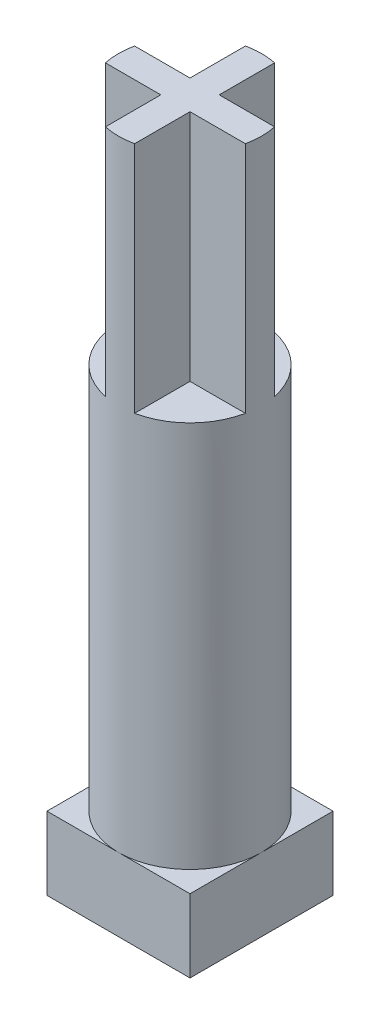
ISO-10303-21;
HEADER;
FILE_DESCRIPTION(('STEP AP214'),'2;1');
FILE_NAME('part.step','',(''),(''),'','','');
FILE_SCHEMA(('AUTOMOTIVE_DESIGN { 1 0 10303 214 1 1 1 1 }'));
ENDSEC;
DATA;
#1=APPLICATION_CONTEXT('core data for automotive mechanical design processes');
#2=APPLICATION_PROTOCOL_DEFINITION('international standard','automotive_design',2000,#1);
#3=PRODUCT_CONTEXT('',#1,'mechanical');
#4=PRODUCT('Part','Part','',(#3));
#5=PRODUCT_RELATED_PRODUCT_CATEGORY('part','',(#4));
#6=PRODUCT_DEFINITION_FORMATION('','',#4);
#7=PRODUCT_DEFINITION_CONTEXT('part definition',#1,'design');
#8=PRODUCT_DEFINITION('design','',#6,#7);
#9=PRODUCT_DEFINITION_SHAPE('','',#8);
#10=(LENGTH_UNIT() NAMED_UNIT(*) SI_UNIT(.MILLI.,.METRE.));
#11=(NAMED_UNIT(*) PLANE_ANGLE_UNIT() SI_UNIT($,.RADIAN.));
#12=(NAMED_UNIT(*) SI_UNIT($,.STERADIAN.) SOLID_ANGLE_UNIT());
#13=UNCERTAINTY_MEASURE_WITH_UNIT(LENGTH_MEASURE(1.E-05),#10,'distance_accuracy_value','');
#14=(GEOMETRIC_REPRESENTATION_CONTEXT(3) GLOBAL_UNCERTAINTY_ASSIGNED_CONTEXT((#13)) GLOBAL_UNIT_ASSIGNED_CONTEXT((#10,
#11,#12)) REPRESENTATION_CONTEXT('',''));
#15=CARTESIAN_POINT('',(0.,0.,0.));
#16=DIRECTION('',(0.,0.,1.));
#17=DIRECTION('',(1.,0.,0.));
#18=AXIS2_PLACEMENT_3D('',#15,#16,#17);
#19=CARTESIAN_POINT('',(-35.4317426595789,-18.3276372888627,44.8719558536028));
#20=DIRECTION('',(0.,-1.,0.));
#21=DIRECTION('',(0.,0.,-1.));
#22=AXIS2_PLACEMENT_3D('',#19,#20,#21);
#23=CYLINDRICAL_SURFACE('',#22,2.45);
#24=CARTESIAN_POINT('',(-35.4317426595789,-17.3276372888627,44.8719558536028));
#25=DIRECTION('',(0.,1.,0.));
#26=DIRECTION('',(0.,0.,1.));
#27=AXIS2_PLACEMENT_3D('',#24,#25,#26);
#28=CIRCLE('',#27,2.45);
#29=CARTESIAN_POINT('',(-34.9317426595789,-17.3276372888627,47.2703928446451));
#30=VERTEX_POINT('',#29);
#31=CARTESIAN_POINT('',(-33.0333056685366,-17.3276372888627,45.3719558536028));
#32=VERTEX_POINT('',#31);
#33=EDGE_CURVE('E12',#30,#32,#28,.T.);
#34=ORIENTED_EDGE('',*,*,#33,.F.);
#35=DIRECTION('',(0.,-1.,0.));
#36=VECTOR('',#35,1.);
#37=CARTESIAN_POINT('',(-34.9317426595789,-9.32763728886266,47.2703928446451));
#38=LINE('',#37,#36);
#39=CARTESIAN_POINT('',(-34.9317426595789,-9.32763728886266,47.2703928446451));
#40=VERTEX_POINT('',#39);
#41=EDGE_CURVE('E282',#40,#30,#38,.T.);
#42=ORIENTED_EDGE('',*,*,#41,.F.);
#43=CARTESIAN_POINT('',(-35.4317426595789,-9.32763728886266,44.8719558536028));
#44=DIRECTION('',(0.,1.,0.));
#45=DIRECTION('',(0.,0.,1.));
#46=AXIS2_PLACEMENT_3D('',#43,#44,#45);
#47=CIRCLE('',#46,2.45);
#48=CARTESIAN_POINT('',(-35.9317426595789,-9.32763728886266,47.2703928446451));
#49=VERTEX_POINT('',#48);
#50=EDGE_CURVE('E233',#49,#40,#47,.T.);
#51=ORIENTED_EDGE('',*,*,#50,.F.);
#52=DIRECTION('',(0.,-1.,0.));
#53=VECTOR('',#52,1.);
#54=CARTESIAN_POINT('',(-35.9317426595789,-9.32763728886266,47.2703928446451));
#55=LINE('',#54,#53);
#56=CARTESIAN_POINT('',(-35.9317426595789,-17.3276372888627,47.2703928446451));
#57=VERTEX_POINT('',#56);
#58=EDGE_CURVE('E286',#49,#57,#55,.T.);
#59=ORIENTED_EDGE('',*,*,#58,.T.);
#60=CARTESIAN_POINT('',(-37.8301796506212,-17.3276372888627,45.3719558536028));
#61=VERTEX_POINT('',#60);
#62=EDGE_CURVE('E64',#61,#57,#28,.T.);
#63=ORIENTED_EDGE('',*,*,#62,.F.);
#64=DIRECTION('',(0.,-1.,0.));
#65=VECTOR('',#64,1.);
#66=CARTESIAN_POINT('',(-37.8301796506212,-9.32763728886266,45.3719558536028));
#67=LINE('',#66,#65);
#68=CARTESIAN_POINT('',(-37.8301796506212,-9.32763728886266,45.3719558536028));
#69=VERTEX_POINT('',#68);
#70=EDGE_CURVE('E294',#69,#61,#67,.T.);
#71=ORIENTED_EDGE('',*,*,#70,.F.);
#72=CARTESIAN_POINT('',(-37.8301796506212,-9.32763728886266,44.3719558536028));
#73=VERTEX_POINT('',#72);
#74=EDGE_CURVE('E248',#73,#69,#47,.T.);
#75=ORIENTED_EDGE('',*,*,#74,.F.);
#76=DIRECTION('',(0.,-1.,0.));
#77=VECTOR('',#76,1.);
#78=CARTESIAN_POINT('',(-37.8301796506212,-9.32763728886266,44.3719558536028));
#79=LINE('',#78,#77);
#80=CARTESIAN_POINT('',(-37.8301796506212,-17.3276372888627,44.3719558536028));
#81=VERTEX_POINT('',#80);
#82=EDGE_CURVE('E298',#73,#81,#79,.T.);
#83=ORIENTED_EDGE('',*,*,#82,.T.);
#84=CARTESIAN_POINT('',(-35.9317426595789,-17.3276372888627,42.4735188625605));
#85=VERTEX_POINT('',#84);
#86=EDGE_CURVE('E332',#85,#81,#28,.T.);
#87=ORIENTED_EDGE('',*,*,#86,.F.);
#88=DIRECTION('',(0.,-1.,0.));
#89=VECTOR('',#88,1.);
#90=CARTESIAN_POINT('',(-35.9317426595789,-9.32763728886266,42.4735188625605));
#91=LINE('',#90,#89);
#92=CARTESIAN_POINT('',(-35.9317426595789,-9.32763728886266,42.4735188625605));
#93=VERTEX_POINT('',#92);
#94=EDGE_CURVE('E306',#93,#85,#91,.T.);
#95=ORIENTED_EDGE('',*,*,#94,.F.);
#96=CARTESIAN_POINT('',(-34.9317426595789,-9.32763728886266,42.4735188625605));
#97=VERTEX_POINT('',#96);
#98=EDGE_CURVE('E234',#97,#93,#47,.T.);
#99=ORIENTED_EDGE('',*,*,#98,.F.);
#100=DIRECTION('',(0.,-1.,0.));
#101=VECTOR('',#100,1.);
#102=CARTESIAN_POINT('',(-34.9317426595789,-9.32763728886266,42.4735188625605));
#103=LINE('',#102,#101);
#104=CARTESIAN_POINT('',(-34.9317426595789,-17.3276372888627,42.4735188625605));
#105=VERTEX_POINT('',#104);
#106=EDGE_CURVE('E310',#97,#105,#103,.T.);
#107=ORIENTED_EDGE('',*,*,#106,.T.);
#108=CARTESIAN_POINT('',(-33.0333056685366,-17.3276372888627,44.3719558536028));
#109=VERTEX_POINT('',#108);
#110=EDGE_CURVE('E63',#109,#105,#28,.T.);
#111=ORIENTED_EDGE('',*,*,#110,.F.);
#112=DIRECTION('',(0.,-1.,0.));
#113=VECTOR('',#112,1.);
#114=CARTESIAN_POINT('',(-33.0333056685366,-9.32763728886266,44.3719558536028));
#115=LINE('',#114,#113);
#116=CARTESIAN_POINT('',(-33.0333056685366,-9.32763728886266,44.3719558536028));
#117=VERTEX_POINT('',#116);
#118=EDGE_CURVE('E318',#117,#109,#115,.T.);
#119=ORIENTED_EDGE('',*,*,#118,.F.);
#120=CARTESIAN_POINT('',(-33.0333056685366,-9.32763728886266,45.3719558536028));
#121=VERTEX_POINT('',#120);
#122=EDGE_CURVE('E229',#121,#117,#47,.T.);
#123=ORIENTED_EDGE('',*,*,#122,.F.);
#124=DIRECTION('',(0.,-1.,0.));
#125=VECTOR('',#124,1.);
#126=CARTESIAN_POINT('',(-33.0333056685366,-9.32763728886266,45.3719558536028));
#127=LINE('',#126,#125);
#128=EDGE_CURVE('E322',#121,#32,#127,.T.);
#129=ORIENTED_EDGE('',*,*,#128,.T.);
#130=EDGE_LOOP('',(#34,#42,#51,#59,#63,#71,#75,#83,#87,#95,#99,#107,#111,#119,#123,#129));
#131=FACE_BOUND('',#130,.T.);
#132=CARTESIAN_POINT('',(-35.4317426595789,-30.5776372888627,44.8719558536028));
#133=DIRECTION('',(0.,-1.,0.));
#134=DIRECTION('',(0.,0.,-1.));
#135=AXIS2_PLACEMENT_3D('',#132,#133,#134);
#136=CIRCLE('',#135,2.45);
#137=CARTESIAN_POINT('',(-35.4317426595789,-30.5776372888627,42.4219558536028));
#138=VERTEX_POINT('',#137);
#139=CARTESIAN_POINT('',(-32.9817426595789,-30.5776372888627,44.8719558536028));
#140=VERTEX_POINT('',#139);
#141=EDGE_CURVE('E212',#138,#140,#136,.T.);
#142=ORIENTED_EDGE('',*,*,#141,.F.);
#143=CARTESIAN_POINT('',(-37.8817426595789,-30.5776372888627,44.8719558536028));
#144=VERTEX_POINT('',#143);
#145=EDGE_CURVE('E71',#144,#138,#136,.T.);
#146=ORIENTED_EDGE('',*,*,#145,.F.);
#147=CARTESIAN_POINT('',(-35.4317426595789,-30.5776372888627,47.3219558536028));
#148=VERTEX_POINT('',#147);
#149=EDGE_CURVE('E75',#148,#144,#136,.T.);
#150=ORIENTED_EDGE('',*,*,#149,.F.);
#151=EDGE_CURVE('E220',#140,#148,#136,.T.);
#152=ORIENTED_EDGE('',*,*,#151,.F.);
#153=EDGE_LOOP('',(#142,#146,#150,#152));
#154=FACE_BOUND('',#153,.T.);
#155=ADVANCED_FACE('F55',(#131,#154),#23,.T.);
#156=CARTESIAN_POINT('',(-35.4317426595789,-17.3276372888627,44.8719558536028));
#157=DIRECTION('',(0.,1.,0.));
#158=DIRECTION('',(0.,0.,1.));
#159=AXIS2_PLACEMENT_3D('',#156,#157,#158);
#160=PLANE('',#159);
#161=DIRECTION('',(0.,0.,1.));
#162=VECTOR('',#161,1.);
#163=CARTESIAN_POINT('',(-35.9317426595788,-17.3276372888627,17.9513586437801));
#164=LINE('',#163,#162);
#165=CARTESIAN_POINT('',(-35.9317426595789,-17.3276372888627,45.3719558536028));
#166=VERTEX_POINT('',#165);
#167=EDGE_CURVE('E226',#166,#57,#164,.T.);
#168=ORIENTED_EDGE('',*,*,#167,.F.);
#169=DIRECTION('',(-1.,0.,0.));
#170=VECTOR('',#169,1.);
#171=CARTESIAN_POINT('',(-22.9042632367363,-17.3276372888627,45.3719558536028));
#172=LINE('',#171,#170);
#173=EDGE_CURVE('E276',#166,#61,#172,.T.);
#174=ORIENTED_EDGE('',*,*,#173,.T.);
#175=ORIENTED_EDGE('',*,*,#62,.T.);
#176=EDGE_LOOP('',(#168,#174,#175));
#177=FACE_BOUND('',#176,.T.);
#178=ADVANCED_FACE('F384',(#177),#160,.T.);
#179=DIRECTION('',(-1.,0.,0.));
#180=VECTOR('',#179,1.);
#181=CARTESIAN_POINT('',(-22.9042632367363,-17.3276372888627,44.3719558536028));
#182=LINE('',#181,#180);
#183=CARTESIAN_POINT('',(-35.9317426595789,-17.3276372888627,44.3719558536028));
#184=VERTEX_POINT('',#183);
#185=EDGE_CURVE('E272',#184,#81,#182,.T.);
#186=ORIENTED_EDGE('',*,*,#185,.F.);
#187=DIRECTION('',(0.,0.,-1.));
#188=VECTOR('',#187,1.);
#189=CARTESIAN_POINT('',(-35.931742659579,-17.3276372888627,17.9513586437802));
#190=LINE('',#189,#188);
#191=EDGE_CURVE('E269',#184,#85,#190,.T.);
#192=ORIENTED_EDGE('',*,*,#191,.T.);
#193=ORIENTED_EDGE('',*,*,#86,.T.);
#194=EDGE_LOOP('',(#186,#192,#193));
#195=FACE_BOUND('',#194,.T.);
#196=ADVANCED_FACE('F388',(#195),#160,.T.);
#197=DIRECTION('',(1.,0.,0.));
#198=VECTOR('',#197,1.);
#199=CARTESIAN_POINT('',(-22.9042632367363,-17.3276372888627,45.3719558536028));
#200=LINE('',#199,#198);
#201=CARTESIAN_POINT('',(-34.9317426595789,-17.3276372888627,45.3719558536028));
#202=VERTEX_POINT('',#201);
#203=EDGE_CURVE('E258',#202,#32,#200,.T.);
#204=ORIENTED_EDGE('',*,*,#203,.F.);
#205=DIRECTION('',(0.,0.,1.));
#206=VECTOR('',#205,1.);
#207=CARTESIAN_POINT('',(-34.9317426595789,-17.3276372888627,17.9513586437801));
#208=LINE('',#207,#206);
#209=EDGE_CURVE('E219',#202,#30,#208,.T.);
#210=ORIENTED_EDGE('',*,*,#209,.T.);
#211=ORIENTED_EDGE('',*,*,#33,.T.);
#212=EDGE_LOOP('',(#204,#210,#211));
#213=FACE_BOUND('',#212,.T.);
#214=ADVANCED_FACE('F392',(#213),#160,.T.);
#215=DIRECTION('',(0.,0.,-1.));
#216=VECTOR('',#215,1.);
#217=CARTESIAN_POINT('',(-34.931742659579,-17.3276372888627,17.9513586437802));
#218=LINE('',#217,#216);
#219=CARTESIAN_POINT('',(-34.9317426595789,-17.3276372888627,44.3719558536028));
#220=VERTEX_POINT('',#219);
#221=EDGE_CURVE('E265',#220,#105,#218,.T.);
#222=ORIENTED_EDGE('',*,*,#221,.F.);
#223=DIRECTION('',(1.,0.,0.));
#224=VECTOR('',#223,1.);
#225=CARTESIAN_POINT('',(-22.9042632367363,-17.3276372888627,44.3719558536028));
#226=LINE('',#225,#224);
#227=EDGE_CURVE('E262',#220,#109,#226,.T.);
#228=ORIENTED_EDGE('',*,*,#227,.T.);
#229=ORIENTED_EDGE('',*,*,#110,.T.);
#230=EDGE_LOOP('',(#222,#228,#229));
#231=FACE_BOUND('',#230,.T.);
#232=ADVANCED_FACE('F341',(#231),#160,.T.);
#233=CARTESIAN_POINT('',(-34.9317426595789,-9.32763728886266,17.9513586437801));
#234=DIRECTION('',(1.,0.,0.));
#235=DIRECTION('',(0.,0.,-1.));
#236=AXIS2_PLACEMENT_3D('',#233,#234,#235);
#237=PLANE('',#236);
#238=ORIENTED_EDGE('',*,*,#209,.F.);
#239=DIRECTION('',(0.,-1.,0.));
#240=VECTOR('',#239,1.);
#241=CARTESIAN_POINT('',(-34.9317426595789,-9.32763728886266,45.3719558536028));
#242=LINE('',#241,#240);
#243=CARTESIAN_POINT('',(-34.9317426595789,-9.32763728886266,45.3719558536028));
#244=VERTEX_POINT('',#243);
#245=EDGE_CURVE('E325',#244,#202,#242,.T.);
#246=ORIENTED_EDGE('',*,*,#245,.F.);
#247=DIRECTION('',(0.,0.,1.));
#248=VECTOR('',#247,1.);
#249=CARTESIAN_POINT('',(-34.9317426595789,-9.32763728886266,17.9513586437801));
#250=LINE('',#249,#248);
#251=EDGE_CURVE('E221',#244,#40,#250,.T.);
#252=ORIENTED_EDGE('',*,*,#251,.T.);
#253=ORIENTED_EDGE('',*,*,#41,.T.);
#254=EDGE_LOOP('',(#238,#246,#252,#253));
#255=FACE_BOUND('',#254,.T.);
#256=ADVANCED_FACE('F367',(#255),#237,.T.);
#257=CARTESIAN_POINT('',(-22.9042632367363,-9.32763728886266,45.3719558536028));
#258=DIRECTION('',(0.,0.,-1.));
#259=DIRECTION('',(-1.,0.,0.));
#260=AXIS2_PLACEMENT_3D('',#257,#258,#259);
#261=PLANE('',#260);
#262=ORIENTED_EDGE('',*,*,#203,.T.);
#263=ORIENTED_EDGE('',*,*,#128,.F.);
#264=DIRECTION('',(1.,0.,0.));
#265=VECTOR('',#264,1.);
#266=CARTESIAN_POINT('',(-22.9042632367363,-9.32763728886266,45.3719558536028));
#267=LINE('',#266,#265);
#268=EDGE_CURVE('E225',#244,#121,#267,.T.);
#269=ORIENTED_EDGE('',*,*,#268,.F.);
#270=ORIENTED_EDGE('',*,*,#245,.T.);
#271=EDGE_LOOP('',(#262,#263,#269,#270));
#272=FACE_BOUND('',#271,.T.);
#273=ADVANCED_FACE('F369',(#272),#261,.F.);
#274=CARTESIAN_POINT('',(-22.9042632367363,-9.32763728886266,44.3719558536028));
#275=DIRECTION('',(0.,0.,-1.));
#276=DIRECTION('',(-1.,0.,0.));
#277=AXIS2_PLACEMENT_3D('',#274,#275,#276);
#278=PLANE('',#277);
#279=ORIENTED_EDGE('',*,*,#227,.F.);
#280=DIRECTION('',(0.,-1.,0.));
#281=VECTOR('',#280,1.);
#282=CARTESIAN_POINT('',(-34.9317426595789,-9.32763728886266,44.3719558536028));
#283=LINE('',#282,#281);
#284=CARTESIAN_POINT('',(-34.9317426595789,-9.32763728886266,44.3719558536028));
#285=VERTEX_POINT('',#284);
#286=EDGE_CURVE('E314',#285,#220,#283,.T.);
#287=ORIENTED_EDGE('',*,*,#286,.F.);
#288=DIRECTION('',(1.,0.,0.));
#289=VECTOR('',#288,1.);
#290=CARTESIAN_POINT('',(-22.9042632367363,-9.32763728886266,44.3719558536028));
#291=LINE('',#290,#289);
#292=EDGE_CURVE('E232',#285,#117,#291,.T.);
#293=ORIENTED_EDGE('',*,*,#292,.T.);
#294=ORIENTED_EDGE('',*,*,#118,.T.);
#295=EDGE_LOOP('',(#279,#287,#293,#294));
#296=FACE_BOUND('',#295,.T.);
#297=ADVANCED_FACE('F373',(#296),#278,.T.);
#298=CARTESIAN_POINT('',(-34.931742659579,-9.32763728886266,17.9513586437802));
#299=DIRECTION('',(-1.,0.,0.));
#300=DIRECTION('',(0.,0.,1.));
#301=AXIS2_PLACEMENT_3D('',#298,#299,#300);
#302=PLANE('',#301);
#303=ORIENTED_EDGE('',*,*,#221,.T.);
#304=ORIENTED_EDGE('',*,*,#106,.F.);
#305=DIRECTION('',(0.,0.,-1.));
#306=VECTOR('',#305,1.);
#307=CARTESIAN_POINT('',(-34.931742659579,-9.32763728886266,17.9513586437802));
#308=LINE('',#307,#306);
#309=EDGE_CURVE('E238',#285,#97,#308,.T.);
#310=ORIENTED_EDGE('',*,*,#309,.F.);
#311=ORIENTED_EDGE('',*,*,#286,.T.);
#312=EDGE_LOOP('',(#303,#304,#310,#311));
#313=FACE_BOUND('',#312,.T.);
#314=ADVANCED_FACE('F347',(#313),#302,.F.);
#315=CARTESIAN_POINT('',(-35.931742659579,-9.32763728886266,17.9513586437802));
#316=DIRECTION('',(-1.,0.,0.));
#317=DIRECTION('',(0.,0.,1.));
#318=AXIS2_PLACEMENT_3D('',#315,#316,#317);
#319=PLANE('',#318);
#320=ORIENTED_EDGE('',*,*,#191,.F.);
#321=DIRECTION('',(0.,-1.,0.));
#322=VECTOR('',#321,1.);
#323=CARTESIAN_POINT('',(-35.9317426595789,-9.32763728886266,44.3719558536028));
#324=LINE('',#323,#322);
#325=CARTESIAN_POINT('',(-35.9317426595789,-9.32763728886266,44.3719558536028));
#326=VERTEX_POINT('',#325);
#327=EDGE_CURVE('E302',#326,#184,#324,.T.);
#328=ORIENTED_EDGE('',*,*,#327,.F.);
#329=DIRECTION('',(0.,0.,-1.));
#330=VECTOR('',#329,1.);
#331=CARTESIAN_POINT('',(-35.931742659579,-9.32763728886266,17.9513586437802));
#332=LINE('',#331,#330);
#333=EDGE_CURVE('E241',#326,#93,#332,.T.);
#334=ORIENTED_EDGE('',*,*,#333,.T.);
#335=ORIENTED_EDGE('',*,*,#94,.T.);
#336=EDGE_LOOP('',(#320,#328,#334,#335));
#337=FACE_BOUND('',#336,.T.);
#338=ADVANCED_FACE('F380',(#337),#319,.T.);
#339=CARTESIAN_POINT('',(-22.9042632367363,-9.32763728886266,44.3719558536028));
#340=DIRECTION('',(0.,0.,1.));
#341=DIRECTION('',(1.,0.,0.));
#342=AXIS2_PLACEMENT_3D('',#339,#340,#341);
#343=PLANE('',#342);
#344=ORIENTED_EDGE('',*,*,#185,.T.);
#345=ORIENTED_EDGE('',*,*,#82,.F.);
#346=DIRECTION('',(-1.,0.,0.));
#347=VECTOR('',#346,1.);
#348=CARTESIAN_POINT('',(-22.9042632367363,-9.32763728886266,44.3719558536028));
#349=LINE('',#348,#347);
#350=EDGE_CURVE('E245',#326,#73,#349,.T.);
#351=ORIENTED_EDGE('',*,*,#350,.F.);
#352=ORIENTED_EDGE('',*,*,#327,.T.);
#353=EDGE_LOOP('',(#344,#345,#351,#352));
#354=FACE_BOUND('',#353,.T.);
#355=ADVANCED_FACE('F448',(#354),#343,.F.);
#356=CARTESIAN_POINT('',(-22.9042632367363,-9.32763728886266,45.3719558536028));
#357=DIRECTION('',(0.,0.,1.));
#358=DIRECTION('',(1.,0.,0.));
#359=AXIS2_PLACEMENT_3D('',#356,#357,#358);
#360=PLANE('',#359);
#361=ORIENTED_EDGE('',*,*,#173,.F.);
#362=DIRECTION('',(0.,-1.,0.));
#363=VECTOR('',#362,1.);
#364=CARTESIAN_POINT('',(-35.9317426595789,-9.32763728886266,45.3719558536028));
#365=LINE('',#364,#363);
#366=CARTESIAN_POINT('',(-35.9317426595789,-9.32763728886266,45.3719558536028));
#367=VERTEX_POINT('',#366);
#368=EDGE_CURVE('E290',#367,#166,#365,.T.);
#369=ORIENTED_EDGE('',*,*,#368,.F.);
#370=DIRECTION('',(-1.,0.,0.));
#371=VECTOR('',#370,1.);
#372=CARTESIAN_POINT('',(-22.9042632367363,-9.32763728886266,45.3719558536028));
#373=LINE('',#372,#371);
#374=EDGE_CURVE('E249',#367,#69,#373,.T.);
#375=ORIENTED_EDGE('',*,*,#374,.T.);
#376=ORIENTED_EDGE('',*,*,#70,.T.);
#377=EDGE_LOOP('',(#361,#369,#375,#376));
#378=FACE_BOUND('',#377,.T.);
#379=ADVANCED_FACE('F458',(#378),#360,.T.);
#380=CARTESIAN_POINT('',(-35.9317426595788,-9.32763728886266,17.9513586437801));
#381=DIRECTION('',(1.,0.,0.));
#382=DIRECTION('',(0.,0.,-1.));
#383=AXIS2_PLACEMENT_3D('',#380,#381,#382);
#384=PLANE('',#383);
#385=ORIENTED_EDGE('',*,*,#167,.T.);
#386=ORIENTED_EDGE('',*,*,#58,.F.);
#387=DIRECTION('',(0.,0.,1.));
#388=VECTOR('',#387,1.);
#389=CARTESIAN_POINT('',(-35.9317426595788,-9.32763728886266,17.9513586437801));
#390=LINE('',#389,#388);
#391=EDGE_CURVE('E253',#367,#49,#390,.T.);
#392=ORIENTED_EDGE('',*,*,#391,.F.);
#393=ORIENTED_EDGE('',*,*,#368,.T.);
#394=EDGE_LOOP('',(#385,#386,#392,#393));
#395=FACE_BOUND('',#394,.T.);
#396=ADVANCED_FACE('F468',(#395),#384,.F.);
#397=CARTESIAN_POINT('',(-22.9042632367363,-9.32763728886266,17.9513586437802));
#398=DIRECTION('',(0.,1.,0.));
#399=DIRECTION('',(0.,0.,1.));
#400=AXIS2_PLACEMENT_3D('',#397,#398,#399);
#401=PLANE('',#400);
#402=ORIENTED_EDGE('',*,*,#251,.F.);
#403=ORIENTED_EDGE('',*,*,#268,.T.);
#404=ORIENTED_EDGE('',*,*,#122,.T.);
#405=ORIENTED_EDGE('',*,*,#292,.F.);
#406=ORIENTED_EDGE('',*,*,#309,.T.);
#407=ORIENTED_EDGE('',*,*,#98,.T.);
#408=ORIENTED_EDGE('',*,*,#333,.F.);
#409=ORIENTED_EDGE('',*,*,#350,.T.);
#410=ORIENTED_EDGE('',*,*,#74,.T.);
#411=ORIENTED_EDGE('',*,*,#374,.F.);
#412=ORIENTED_EDGE('',*,*,#391,.T.);
#413=ORIENTED_EDGE('',*,*,#50,.T.);
#414=EDGE_LOOP('',(#402,#403,#404,#405,#406,#407,#408,#409,#410,#411,#412,#413));
#415=FACE_BOUND('',#414,.T.);
#416=ADVANCED_FACE('F363',(#415),#401,.T.);
#417=CARTESIAN_POINT('',(0.,-30.5776372888627,0.));
#418=DIRECTION('',(0.,1.,0.));
#419=DIRECTION('',(0.,0.,1.));
#420=AXIS2_PLACEMENT_3D('',#417,#418,#419);
#421=PLANE('',#420);
#422=DIRECTION('',(1.,0.,0.));
#423=VECTOR('',#422,1.);
#424=CARTESIAN_POINT('',(-37.8817426595789,-30.5776372888627,42.4219558536028));
#425=LINE('',#424,#423);
#426=CARTESIAN_POINT('',(-32.9817426595789,-30.5776372888627,42.4219558536028));
#427=VERTEX_POINT('',#426);
#428=EDGE_CURVE('E637',#138,#427,#425,.T.);
#429=ORIENTED_EDGE('',*,*,#428,.F.);
#430=ORIENTED_EDGE('',*,*,#141,.T.);
#431=DIRECTION('',(0.,0.,1.));
#432=VECTOR('',#431,1.);
#433=CARTESIAN_POINT('',(-32.9817426595789,-30.5776372888627,42.4219558536028));
#434=LINE('',#433,#432);
#435=EDGE_CURVE('E651',#427,#140,#434,.T.);
#436=ORIENTED_EDGE('',*,*,#435,.F.);
#437=EDGE_LOOP('',(#429,#430,#436));
#438=FACE_BOUND('',#437,.T.);
#439=ADVANCED_FACE('F487',(#438),#421,.T.);
#440=CARTESIAN_POINT('',(-32.9817426595789,-30.5776372888627,47.3219558536028));
#441=VERTEX_POINT('',#440);
#442=EDGE_CURVE('E205',#140,#441,#434,.T.);
#443=ORIENTED_EDGE('',*,*,#442,.F.);
#444=ORIENTED_EDGE('',*,*,#151,.T.);
#445=DIRECTION('',(-1.,0.,0.));
#446=VECTOR('',#445,1.);
#447=CARTESIAN_POINT('',(-37.8817426595789,-30.5776372888627,47.3219558536028));
#448=LINE('',#447,#446);
#449=EDGE_CURVE('E632',#441,#148,#448,.T.);
#450=ORIENTED_EDGE('',*,*,#449,.F.);
#451=EDGE_LOOP('',(#443,#444,#450));
#452=FACE_BOUND('',#451,.T.);
#453=ADVANCED_FACE('F505',(#452),#421,.T.);
#454=CARTESIAN_POINT('',(-37.8817426595789,-30.5776372888627,47.3219558536028));
#455=VERTEX_POINT('',#454);
#456=EDGE_CURVE('E653',#148,#455,#448,.T.);
#457=ORIENTED_EDGE('',*,*,#456,.F.);
#458=ORIENTED_EDGE('',*,*,#149,.T.);
#459=DIRECTION('',(0.,0.,-1.));
#460=VECTOR('',#459,1.);
#461=CARTESIAN_POINT('',(-37.8817426595789,-30.5776372888627,42.4219558536028));
#462=LINE('',#461,#460);
#463=EDGE_CURVE('E631',#455,#144,#462,.T.);
#464=ORIENTED_EDGE('',*,*,#463,.F.);
#465=EDGE_LOOP('',(#457,#458,#464));
#466=FACE_BOUND('',#465,.T.);
#467=ADVANCED_FACE('F515',(#466),#421,.T.);
#468=CARTESIAN_POINT('',(-32.9817426595789,-33.0776372888627,42.4219558536028));
#469=DIRECTION('',(-1.,0.,0.));
#470=DIRECTION('',(0.,0.,1.));
#471=AXIS2_PLACEMENT_3D('',#468,#469,#470);
#472=PLANE('',#471);
#473=ORIENTED_EDGE('',*,*,#435,.T.);
#474=ORIENTED_EDGE('',*,*,#442,.T.);
#475=DIRECTION('',(0.,1.,0.));
#476=VECTOR('',#475,1.);
#477=CARTESIAN_POINT('',(-32.9817426595789,-33.0776372888627,47.3219558536028));
#478=LINE('',#477,#476);
#479=CARTESIAN_POINT('',(-32.9817426595789,-33.0776372888627,47.3219558536028));
#480=VERTEX_POINT('',#479);
#481=EDGE_CURVE('E183',#480,#441,#478,.T.);
#482=ORIENTED_EDGE('',*,*,#481,.F.);
#483=DIRECTION('',(0.,0.,1.));
#484=VECTOR('',#483,1.);
#485=CARTESIAN_POINT('',(-32.9817426595789,-33.0776372888627,42.4219558536028));
#486=LINE('',#485,#484);
#487=CARTESIAN_POINT('',(-32.9817426595789,-33.0776372888627,42.4219558536028));
#488=VERTEX_POINT('',#487);
#489=EDGE_CURVE('E190',#488,#480,#486,.T.);
#490=ORIENTED_EDGE('',*,*,#489,.F.);
#491=DIRECTION('',(0.,1.,0.));
#492=VECTOR('',#491,1.);
#493=CARTESIAN_POINT('',(-32.9817426595789,-33.0776372888627,42.4219558536028));
#494=LINE('',#493,#492);
#495=EDGE_CURVE('E644',#488,#427,#494,.T.);
#496=ORIENTED_EDGE('',*,*,#495,.T.);
#497=EDGE_LOOP('',(#473,#474,#482,#490,#496));
#498=FACE_BOUND('',#497,.T.);
#499=ADVANCED_FACE('F203',(#498),#472,.F.);
#500=CARTESIAN_POINT('',(-37.8817426595789,-33.0776372888627,47.3219558536028));
#501=DIRECTION('',(0.,0.,-1.));
#502=DIRECTION('',(-1.,0.,0.));
#503=AXIS2_PLACEMENT_3D('',#500,#501,#502);
#504=PLANE('',#503);
#505=ORIENTED_EDGE('',*,*,#449,.T.);
#506=ORIENTED_EDGE('',*,*,#456,.T.);
#507=DIRECTION('',(0.,1.,0.));
#508=VECTOR('',#507,1.);
#509=CARTESIAN_POINT('',(-37.8817426595789,-33.0776372888627,47.3219558536028));
#510=LINE('',#509,#508);
#511=CARTESIAN_POINT('',(-37.8817426595789,-33.0776372888627,47.3219558536028));
#512=VERTEX_POINT('',#511);
#513=EDGE_CURVE('E185',#512,#455,#510,.T.);
#514=ORIENTED_EDGE('',*,*,#513,.F.);
#515=DIRECTION('',(-1.,0.,0.));
#516=VECTOR('',#515,1.);
#517=CARTESIAN_POINT('',(-37.8817426595789,-33.0776372888627,47.3219558536028));
#518=LINE('',#517,#516);
#519=EDGE_CURVE('E178',#480,#512,#518,.T.);
#520=ORIENTED_EDGE('',*,*,#519,.F.);
#521=ORIENTED_EDGE('',*,*,#481,.T.);
#522=EDGE_LOOP('',(#505,#506,#514,#520,#521));
#523=FACE_BOUND('',#522,.T.);
#524=ADVANCED_FACE('F181',(#523),#504,.F.);
#525=CARTESIAN_POINT('',(-37.8817426595789,-33.0776372888627,42.4219558536028));
#526=DIRECTION('',(1.,0.,0.));
#527=DIRECTION('',(0.,0.,-1.));
#528=AXIS2_PLACEMENT_3D('',#525,#526,#527);
#529=PLANE('',#528);
#530=ORIENTED_EDGE('',*,*,#463,.T.);
#531=CARTESIAN_POINT('',(-37.8817426595789,-30.5776372888627,42.4219558536028));
#532=VERTEX_POINT('',#531);
#533=EDGE_CURVE('E624',#144,#532,#462,.T.);
#534=ORIENTED_EDGE('',*,*,#533,.T.);
#535=DIRECTION('',(0.,1.,0.));
#536=VECTOR('',#535,1.);
#537=CARTESIAN_POINT('',(-37.8817426595789,-33.0776372888627,42.4219558536028));
#538=LINE('',#537,#536);
#539=CARTESIAN_POINT('',(-37.8817426595789,-33.0776372888627,42.4219558536028));
#540=VERTEX_POINT('',#539);
#541=EDGE_CURVE('E213',#540,#532,#538,.T.);
#542=ORIENTED_EDGE('',*,*,#541,.F.);
#543=DIRECTION('',(0.,0.,-1.));
#544=VECTOR('',#543,1.);
#545=CARTESIAN_POINT('',(-37.8817426595789,-33.0776372888627,42.4219558536028));
#546=LINE('',#545,#544);
#547=EDGE_CURVE('E189',#512,#540,#546,.T.);
#548=ORIENTED_EDGE('',*,*,#547,.F.);
#549=ORIENTED_EDGE('',*,*,#513,.T.);
#550=EDGE_LOOP('',(#530,#534,#542,#548,#549));
#551=FACE_BOUND('',#550,.T.);
#552=ADVANCED_FACE('F540',(#551),#529,.F.);
#553=CARTESIAN_POINT('',(-37.8817426595789,-33.0776372888627,42.4219558536028));
#554=DIRECTION('',(0.,0.,1.));
#555=DIRECTION('',(1.,0.,0.));
#556=AXIS2_PLACEMENT_3D('',#553,#554,#555);
#557=PLANE('',#556);
#558=EDGE_CURVE('E200',#532,#138,#425,.T.);
#559=ORIENTED_EDGE('',*,*,#558,.T.);
#560=ORIENTED_EDGE('',*,*,#428,.T.);
#561=ORIENTED_EDGE('',*,*,#495,.F.);
#562=DIRECTION('',(1.,0.,0.));
#563=VECTOR('',#562,1.);
#564=CARTESIAN_POINT('',(-37.8817426595789,-33.0776372888627,42.4219558536028));
#565=LINE('',#564,#563);
#566=EDGE_CURVE('E195',#540,#488,#565,.T.);
#567=ORIENTED_EDGE('',*,*,#566,.F.);
#568=ORIENTED_EDGE('',*,*,#541,.T.);
#569=EDGE_LOOP('',(#559,#560,#561,#567,#568));
#570=FACE_BOUND('',#569,.T.);
#571=ADVANCED_FACE('F549',(#570),#557,.F.);
#572=CARTESIAN_POINT('',(0.,-33.0776372888627,0.));
#573=DIRECTION('',(0.,1.,0.));
#574=DIRECTION('',(0.,0.,1.));
#575=AXIS2_PLACEMENT_3D('',#572,#573,#574);
#576=PLANE('',#575);
#577=ORIENTED_EDGE('',*,*,#489,.T.);
#578=ORIENTED_EDGE('',*,*,#519,.T.);
#579=ORIENTED_EDGE('',*,*,#547,.T.);
#580=ORIENTED_EDGE('',*,*,#566,.T.);
#581=EDGE_LOOP('',(#577,#578,#579,#580));
#582=FACE_BOUND('',#581,.T.);
#583=ADVANCED_FACE('F193',(#582),#576,.F.);
#584=ORIENTED_EDGE('',*,*,#533,.F.);
#585=ORIENTED_EDGE('',*,*,#145,.T.);
#586=ORIENTED_EDGE('',*,*,#558,.F.);
#587=EDGE_LOOP('',(#584,#585,#586));
#588=FACE_BOUND('',#587,.T.);
#589=ADVANCED_FACE('F508',(#588),#421,.T.);
#590=CLOSED_SHELL('',(#155,#178,#196,#214,#232,#256,#273,#297,#314,#338,#355,#379,#396,#416,
#439,#453,#467,#499,#524,#552,#571,#583,#589));
#591=MANIFOLD_SOLID_BREP('B2',#590);
#592=ADVANCED_BREP_SHAPE_REPRESENTATION('',(#18,#591),#14);
#593=SHAPE_DEFINITION_REPRESENTATION(#9,#592);
ENDSEC;
END-ISO-10303-21;
